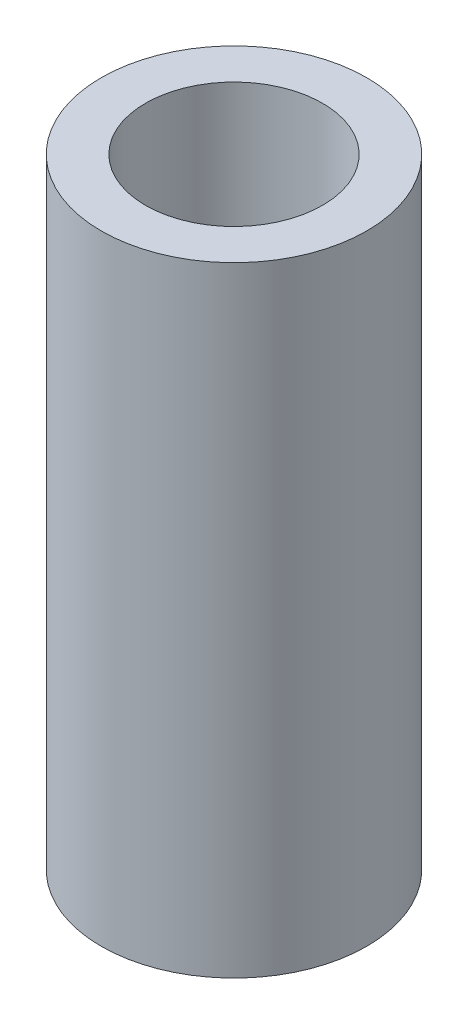
ISO-10303-21;
HEADER;
FILE_DESCRIPTION(('STEP AP214'),'2;1');
FILE_NAME('part.step','',(''),(''),'','','');
FILE_SCHEMA(('AUTOMOTIVE_DESIGN { 1 0 10303 214 1 1 1 1 }'));
ENDSEC;
DATA;
#1=APPLICATION_CONTEXT('core data for automotive mechanical design processes');
#2=APPLICATION_PROTOCOL_DEFINITION('international standard','automotive_design',2000,#1);
#3=PRODUCT_CONTEXT('',#1,'mechanical');
#4=PRODUCT('Part','Part','',(#3));
#5=PRODUCT_RELATED_PRODUCT_CATEGORY('part','',(#4));
#6=PRODUCT_DEFINITION_FORMATION('','',#4);
#7=PRODUCT_DEFINITION_CONTEXT('part definition',#1,'design');
#8=PRODUCT_DEFINITION('design','',#6,#7);
#9=PRODUCT_DEFINITION_SHAPE('','',#8);
#10=(LENGTH_UNIT() NAMED_UNIT(*) SI_UNIT(.MILLI.,.METRE.));
#11=(NAMED_UNIT(*) PLANE_ANGLE_UNIT() SI_UNIT($,.RADIAN.));
#12=(NAMED_UNIT(*) SI_UNIT($,.STERADIAN.) SOLID_ANGLE_UNIT());
#13=UNCERTAINTY_MEASURE_WITH_UNIT(LENGTH_MEASURE(1.E-05),#10,'distance_accuracy_value','');
#14=(GEOMETRIC_REPRESENTATION_CONTEXT(3) GLOBAL_UNCERTAINTY_ASSIGNED_CONTEXT((#13)) GLOBAL_UNIT_ASSIGNED_CONTEXT((#10,
#11,#12)) REPRESENTATION_CONTEXT('',''));
#15=CARTESIAN_POINT('',(0.,0.,0.));
#16=DIRECTION('',(0.,0.,1.));
#17=DIRECTION('',(1.,0.,0.));
#18=AXIS2_PLACEMENT_3D('',#15,#16,#17);
#19=CARTESIAN_POINT('',(0.,-2.68998383093097,0.));
#20=DIRECTION('',(0.,-1.,0.));
#21=DIRECTION('',(0.,0.,-1.));
#22=AXIS2_PLACEMENT_3D('',#19,#20,#21);
#23=CYLINDRICAL_SURFACE('',#22,3.);
#24=CARTESIAN_POINT('',(0.,0.,0.));
#25=DIRECTION('',(0.,-1.,0.));
#26=DIRECTION('',(0.,0.,-1.));
#27=AXIS2_PLACEMENT_3D('',#24,#25,#26);
#28=CIRCLE('',#27,3.);
#29=CARTESIAN_POINT('',(0.,0.,-3.));
#30=VERTEX_POINT('',#29);
#31=EDGE_CURVE('E10',#30,#30,#28,.T.);
#32=ORIENTED_EDGE('',*,*,#31,.F.);
#33=EDGE_LOOP('',(#32));
#34=FACE_BOUND('',#33,.T.);
#35=CARTESIAN_POINT('',(0.,14.,0.));
#36=DIRECTION('',(0.,-1.,0.));
#37=DIRECTION('',(0.,0.,-1.));
#38=AXIS2_PLACEMENT_3D('',#35,#36,#37);
#39=CIRCLE('',#38,3.);
#40=CARTESIAN_POINT('',(0.,14.,-3.));
#41=VERTEX_POINT('',#40);
#42=EDGE_CURVE('E40',#41,#41,#39,.T.);
#43=ORIENTED_EDGE('',*,*,#42,.T.);
#44=EDGE_LOOP('',(#43));
#45=FACE_BOUND('',#44,.T.);
#46=ADVANCED_FACE('F34',(#34,#45),#23,.T.);
#47=CARTESIAN_POINT('',(-3.,0.,0.));
#48=DIRECTION('',(0.,1.,0.));
#49=DIRECTION('',(0.,0.,1.));
#50=AXIS2_PLACEMENT_3D('',#47,#48,#49);
#51=PLANE('',#50);
#52=CARTESIAN_POINT('',(0.,0.,0.));
#53=DIRECTION('',(0.,1.,0.));
#54=DIRECTION('',(0.,0.,1.));
#55=AXIS2_PLACEMENT_3D('',#52,#53,#54);
#56=CIRCLE('',#55,2.);
#57=CARTESIAN_POINT('',(0.,0.,2.));
#58=VERTEX_POINT('',#57);
#59=EDGE_CURVE('E48',#58,#58,#56,.T.);
#60=ORIENTED_EDGE('',*,*,#59,.T.);
#61=EDGE_LOOP('',(#60));
#62=FACE_BOUND('',#61,.T.);
#63=ORIENTED_EDGE('',*,*,#31,.T.);
#64=EDGE_LOOP('',(#63));
#65=FACE_BOUND('',#64,.T.);
#66=ADVANCED_FACE('F54',(#62,#65),#51,.F.);
#67=CARTESIAN_POINT('',(0.,14.,0.));
#68=DIRECTION('',(0.,-1.,0.));
#69=DIRECTION('',(0.,0.,-1.));
#70=AXIS2_PLACEMENT_3D('',#67,#68,#69);
#71=PLANE('',#70);
#72=CARTESIAN_POINT('',(0.,14.,0.));
#73=DIRECTION('',(0.,1.,0.));
#74=DIRECTION('',(0.,0.,1.));
#75=AXIS2_PLACEMENT_3D('',#72,#73,#74);
#76=CIRCLE('',#75,2.);
#77=CARTESIAN_POINT('',(0.,14.,2.));
#78=VERTEX_POINT('',#77);
#79=EDGE_CURVE('E44',#78,#78,#76,.T.);
#80=ORIENTED_EDGE('',*,*,#79,.F.);
#81=EDGE_LOOP('',(#80));
#82=FACE_BOUND('',#81,.T.);
#83=ORIENTED_EDGE('',*,*,#42,.F.);
#84=EDGE_LOOP('',(#83));
#85=FACE_BOUND('',#84,.T.);
#86=ADVANCED_FACE('F58',(#82,#85),#71,.F.);
#87=CARTESIAN_POINT('',(0.,14.,0.));
#88=DIRECTION('',(0.,-1.,0.));
#89=DIRECTION('',(0.,0.,-1.));
#90=AXIS2_PLACEMENT_3D('',#87,#88,#89);
#91=CYLINDRICAL_SURFACE('',#90,2.);
#92=ORIENTED_EDGE('',*,*,#79,.T.);
#93=EDGE_LOOP('',(#92));
#94=FACE_BOUND('',#93,.T.);
#95=ORIENTED_EDGE('',*,*,#59,.F.);
#96=EDGE_LOOP('',(#95));
#97=FACE_BOUND('',#96,.T.);
#98=ADVANCED_FACE('F56',(#94,#97),#91,.F.);
#99=CLOSED_SHELL('',(#46,#66,#86,#98));
#100=MANIFOLD_SOLID_BREP('B2',#99);
#101=ADVANCED_BREP_SHAPE_REPRESENTATION('',(#18,#100),#14);
#102=SHAPE_DEFINITION_REPRESENTATION(#9,#101);
ENDSEC;
END-ISO-10303-21;
